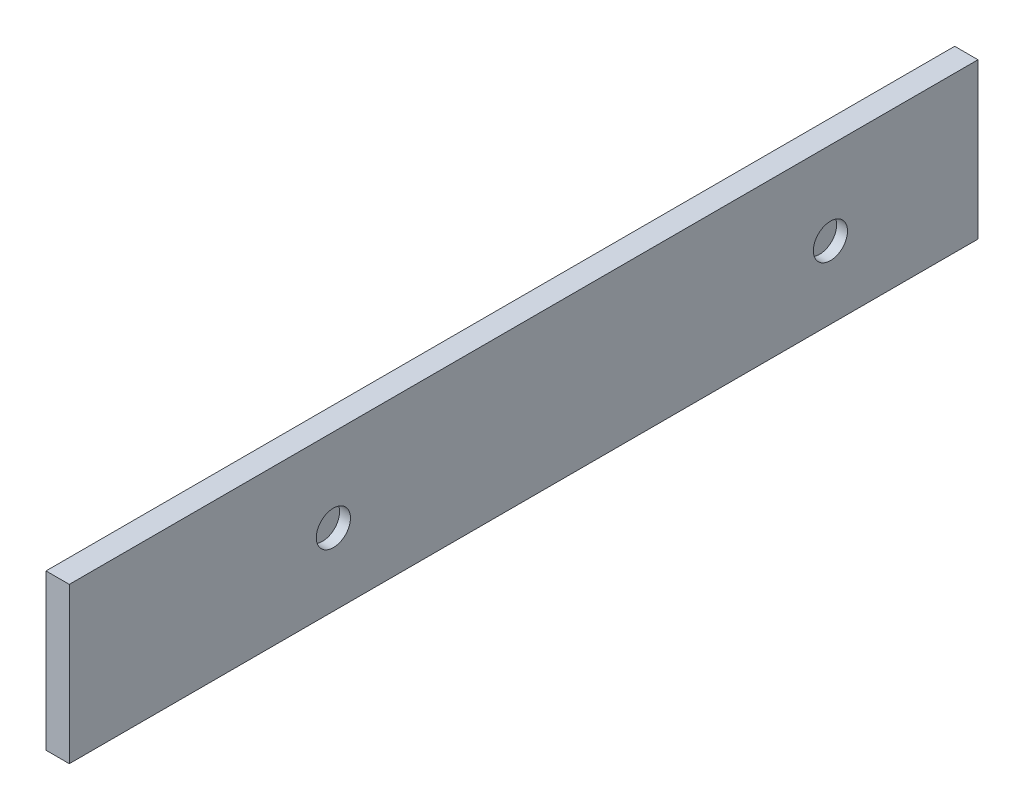
ISO-10303-21;
HEADER;
FILE_DESCRIPTION(('STEP AP214'),'2;1');
FILE_NAME('part.step','',(''),(''),'','','');
FILE_SCHEMA(('AUTOMOTIVE_DESIGN { 1 0 10303 214 1 1 1 1 }'));
ENDSEC;
DATA;
#1=APPLICATION_CONTEXT('core data for automotive mechanical design processes');
#2=APPLICATION_PROTOCOL_DEFINITION('international standard','automotive_design',2000,#1);
#3=PRODUCT_CONTEXT('',#1,'mechanical');
#4=PRODUCT('Part','Part','',(#3));
#5=PRODUCT_RELATED_PRODUCT_CATEGORY('part','',(#4));
#6=PRODUCT_DEFINITION_FORMATION('','',#4);
#7=PRODUCT_DEFINITION_CONTEXT('part definition',#1,'design');
#8=PRODUCT_DEFINITION('design','',#6,#7);
#9=PRODUCT_DEFINITION_SHAPE('','',#8);
#10=(LENGTH_UNIT() NAMED_UNIT(*) SI_UNIT(.MILLI.,.METRE.));
#11=(NAMED_UNIT(*) PLANE_ANGLE_UNIT() SI_UNIT($,.RADIAN.));
#12=(NAMED_UNIT(*) SI_UNIT($,.STERADIAN.) SOLID_ANGLE_UNIT());
#13=UNCERTAINTY_MEASURE_WITH_UNIT(LENGTH_MEASURE(1.E-05),#10,'distance_accuracy_value','');
#14=(GEOMETRIC_REPRESENTATION_CONTEXT(3) GLOBAL_UNCERTAINTY_ASSIGNED_CONTEXT((#13)) GLOBAL_UNIT_ASSIGNED_CONTEXT((#10,
#11,#12)) REPRESENTATION_CONTEXT('',''));
#15=CARTESIAN_POINT('',(0.,0.,0.));
#16=DIRECTION('',(0.,0.,1.));
#17=DIRECTION('',(1.,0.,0.));
#18=AXIS2_PLACEMENT_3D('',#15,#16,#17);
#19=CARTESIAN_POINT('',(15.,0.,0.));
#20=DIRECTION('',(0.,0.,-1.));
#21=DIRECTION('',(-1.,0.,0.));
#22=AXIS2_PLACEMENT_3D('',#19,#20,#21);
#23=PLANE('',#22);
#24=DIRECTION('',(0.,-1.,0.));
#25=VECTOR('',#24,1.);
#26=CARTESIAN_POINT('',(0.,0.,0.));
#27=LINE('',#26,#25);
#28=CARTESIAN_POINT('',(0.,100.,0.));
#29=VERTEX_POINT('',#28);
#30=CARTESIAN_POINT('',(0.,0.,0.));
#31=VERTEX_POINT('',#30);
#32=EDGE_CURVE('E96',#29,#31,#27,.T.);
#33=ORIENTED_EDGE('',*,*,#32,.T.);
#34=DIRECTION('',(-1.,0.,0.));
#35=VECTOR('',#34,1.);
#36=CARTESIAN_POINT('',(15.,0.,0.));
#37=LINE('',#36,#35);
#38=CARTESIAN_POINT('',(15.,0.,0.));
#39=VERTEX_POINT('',#38);
#40=EDGE_CURVE('E11',#39,#31,#37,.T.);
#41=ORIENTED_EDGE('',*,*,#40,.F.);
#42=DIRECTION('',(0.,-1.,0.));
#43=VECTOR('',#42,1.);
#44=CARTESIAN_POINT('',(15.,0.,0.));
#45=LINE('',#44,#43);
#46=CARTESIAN_POINT('',(15.,100.,0.));
#47=VERTEX_POINT('',#46);
#48=EDGE_CURVE('E84',#47,#39,#45,.T.);
#49=ORIENTED_EDGE('',*,*,#48,.F.);
#50=DIRECTION('',(-1.,0.,0.));
#51=VECTOR('',#50,1.);
#52=CARTESIAN_POINT('',(15.,100.,0.));
#53=LINE('',#52,#51);
#54=EDGE_CURVE('E92',#47,#29,#53,.T.);
#55=ORIENTED_EDGE('',*,*,#54,.T.);
#56=EDGE_LOOP('',(#33,#41,#49,#55));
#57=FACE_BOUND('',#56,.T.);
#58=ADVANCED_FACE('F33',(#57),#23,.F.);
#59=CARTESIAN_POINT('',(15.,0.,0.));
#60=DIRECTION('',(0.,1.,0.));
#61=DIRECTION('',(0.,0.,1.));
#62=AXIS2_PLACEMENT_3D('',#59,#60,#61);
#63=PLANE('',#62);
#64=DIRECTION('',(0.,0.,-1.));
#65=VECTOR('',#64,1.);
#66=CARTESIAN_POINT('',(0.,0.,0.));
#67=LINE('',#66,#65);
#68=CARTESIAN_POINT('',(0.,0.,-585.));
#69=VERTEX_POINT('',#68);
#70=EDGE_CURVE('E88',#31,#69,#67,.T.);
#71=ORIENTED_EDGE('',*,*,#70,.T.);
#72=DIRECTION('',(-1.,0.,0.));
#73=VECTOR('',#72,1.);
#74=CARTESIAN_POINT('',(15.,0.,-585.));
#75=LINE('',#74,#73);
#76=CARTESIAN_POINT('',(15.,0.,-585.));
#77=VERTEX_POINT('',#76);
#78=EDGE_CURVE('E41',#77,#69,#75,.T.);
#79=ORIENTED_EDGE('',*,*,#78,.F.);
#80=DIRECTION('',(0.,0.,-1.));
#81=VECTOR('',#80,1.);
#82=CARTESIAN_POINT('',(15.,0.,0.));
#83=LINE('',#82,#81);
#84=EDGE_CURVE('E79',#39,#77,#83,.T.);
#85=ORIENTED_EDGE('',*,*,#84,.F.);
#86=ORIENTED_EDGE('',*,*,#40,.T.);
#87=EDGE_LOOP('',(#71,#79,#85,#86));
#88=FACE_BOUND('',#87,.T.);
#89=ADVANCED_FACE('F87',(#88),#63,.F.);
#90=CARTESIAN_POINT('',(15.,0.,-585.));
#91=DIRECTION('',(0.,0.,1.));
#92=DIRECTION('',(1.,0.,0.));
#93=AXIS2_PLACEMENT_3D('',#90,#91,#92);
#94=PLANE('',#93);
#95=DIRECTION('',(0.,1.,0.));
#96=VECTOR('',#95,1.);
#97=CARTESIAN_POINT('',(0.,0.,-585.));
#98=LINE('',#97,#96);
#99=CARTESIAN_POINT('',(0.,100.,-585.));
#100=VERTEX_POINT('',#99);
#101=EDGE_CURVE('E66',#69,#100,#98,.T.);
#102=ORIENTED_EDGE('',*,*,#101,.T.);
#103=DIRECTION('',(-1.,0.,0.));
#104=VECTOR('',#103,1.);
#105=CARTESIAN_POINT('',(15.,100.,-585.));
#106=LINE('',#105,#104);
#107=CARTESIAN_POINT('',(15.,100.,-585.));
#108=VERTEX_POINT('',#107);
#109=EDGE_CURVE('E89',#108,#100,#106,.T.);
#110=ORIENTED_EDGE('',*,*,#109,.F.);
#111=DIRECTION('',(0.,1.,0.));
#112=VECTOR('',#111,1.);
#113=CARTESIAN_POINT('',(15.,0.,-585.));
#114=LINE('',#113,#112);
#115=EDGE_CURVE('E82',#77,#108,#114,.T.);
#116=ORIENTED_EDGE('',*,*,#115,.F.);
#117=ORIENTED_EDGE('',*,*,#78,.T.);
#118=EDGE_LOOP('',(#102,#110,#116,#117));
#119=FACE_BOUND('',#118,.T.);
#120=ADVANCED_FACE('F90',(#119),#94,.F.);
#121=CARTESIAN_POINT('',(15.,100.,0.));
#122=DIRECTION('',(0.,-1.,0.));
#123=DIRECTION('',(0.,0.,-1.));
#124=AXIS2_PLACEMENT_3D('',#121,#122,#123);
#125=PLANE('',#124);
#126=DIRECTION('',(0.,0.,1.));
#127=VECTOR('',#126,1.);
#128=CARTESIAN_POINT('',(0.,100.,0.));
#129=LINE('',#128,#127);
#130=EDGE_CURVE('E72',#100,#29,#129,.T.);
#131=ORIENTED_EDGE('',*,*,#130,.T.);
#132=ORIENTED_EDGE('',*,*,#54,.F.);
#133=DIRECTION('',(0.,0.,1.));
#134=VECTOR('',#133,1.);
#135=CARTESIAN_POINT('',(15.,100.,0.));
#136=LINE('',#135,#134);
#137=EDGE_CURVE('E49',#108,#47,#136,.T.);
#138=ORIENTED_EDGE('',*,*,#137,.F.);
#139=ORIENTED_EDGE('',*,*,#109,.T.);
#140=EDGE_LOOP('',(#131,#132,#138,#139));
#141=FACE_BOUND('',#140,.T.);
#142=ADVANCED_FACE('F104',(#141),#125,.F.);
#143=CARTESIAN_POINT('',(15.,0.,0.));
#144=DIRECTION('',(-1.,0.,0.));
#145=DIRECTION('',(0.,0.,1.));
#146=AXIS2_PLACEMENT_3D('',#143,#144,#145);
#147=PLANE('',#146);
#148=CARTESIAN_POINT('',(15.,46.5,-490.));
#149=DIRECTION('',(1.,0.,0.));
#150=DIRECTION('',(0.,0.,-1.));
#151=AXIS2_PLACEMENT_3D('',#148,#149,#150);
#152=CIRCLE('',#151,11.);
#153=CARTESIAN_POINT('',(15.,46.5,-501.));
#154=VERTEX_POINT('',#153);
#155=EDGE_CURVE('E116',#154,#154,#152,.T.);
#156=ORIENTED_EDGE('',*,*,#155,.F.);
#157=EDGE_LOOP('',(#156));
#158=FACE_BOUND('',#157,.T.);
#159=CARTESIAN_POINT('',(15.,46.5,-170.));
#160=DIRECTION('',(1.,0.,0.));
#161=DIRECTION('',(0.,0.,-1.));
#162=AXIS2_PLACEMENT_3D('',#159,#160,#161);
#163=CIRCLE('',#162,11.);
#164=CARTESIAN_POINT('',(15.,46.5,-181.));
#165=VERTEX_POINT('',#164);
#166=EDGE_CURVE('E110',#165,#165,#163,.T.);
#167=ORIENTED_EDGE('',*,*,#166,.F.);
#168=EDGE_LOOP('',(#167));
#169=FACE_BOUND('',#168,.T.);
#170=ORIENTED_EDGE('',*,*,#48,.T.);
#171=ORIENTED_EDGE('',*,*,#84,.T.);
#172=ORIENTED_EDGE('',*,*,#115,.T.);
#173=ORIENTED_EDGE('',*,*,#137,.T.);
#174=EDGE_LOOP('',(#170,#171,#172,#173));
#175=FACE_BOUND('',#174,.T.);
#176=ADVANCED_FACE('F80',(#158,#169,#175),#147,.F.);
#177=CARTESIAN_POINT('',(0.,0.,0.));
#178=DIRECTION('',(-1.,0.,0.));
#179=DIRECTION('',(0.,0.,1.));
#180=AXIS2_PLACEMENT_3D('',#177,#178,#179);
#181=PLANE('',#180);
#182=ORIENTED_EDGE('',*,*,#32,.F.);
#183=ORIENTED_EDGE('',*,*,#130,.F.);
#184=ORIENTED_EDGE('',*,*,#101,.F.);
#185=ORIENTED_EDGE('',*,*,#70,.F.);
#186=EDGE_LOOP('',(#182,#183,#184,#185));
#187=FACE_BOUND('',#186,.T.);
#188=ADVANCED_FACE('F107',(#187),#181,.T.);
#189=CARTESIAN_POINT('',(8.,46.5,-170.));
#190=DIRECTION('',(1.,0.,0.));
#191=DIRECTION('',(0.,0.,-1.));
#192=AXIS2_PLACEMENT_3D('',#189,#190,#191);
#193=CYLINDRICAL_SURFACE('',#192,11.);
#194=CARTESIAN_POINT('',(8.,46.5,-170.));
#195=DIRECTION('',(1.,0.,0.));
#196=DIRECTION('',(0.,0.,-1.));
#197=AXIS2_PLACEMENT_3D('',#194,#195,#196);
#198=CIRCLE('',#197,11.);
#199=CARTESIAN_POINT('',(8.,46.5,-181.));
#200=VERTEX_POINT('',#199);
#201=EDGE_CURVE('E99',#200,#200,#198,.T.);
#202=ORIENTED_EDGE('',*,*,#201,.F.);
#203=EDGE_LOOP('',(#202));
#204=FACE_BOUND('',#203,.T.);
#205=ORIENTED_EDGE('',*,*,#166,.T.);
#206=EDGE_LOOP('',(#205));
#207=FACE_BOUND('',#206,.T.);
#208=ADVANCED_FACE('F136',(#204,#207),#193,.F.);
#209=CARTESIAN_POINT('',(8.,46.5,-170.));
#210=DIRECTION('',(1.,0.,0.));
#211=DIRECTION('',(0.,0.,-1.));
#212=AXIS2_PLACEMENT_3D('',#209,#210,#211);
#213=PLANE('',#212);
#214=ORIENTED_EDGE('',*,*,#201,.T.);
#215=EDGE_LOOP('',(#214));
#216=FACE_BOUND('',#215,.T.);
#217=ADVANCED_FACE('F127',(#216),#213,.T.);
#218=CARTESIAN_POINT('',(8.,46.5,-490.));
#219=DIRECTION('',(1.,0.,0.));
#220=DIRECTION('',(0.,0.,-1.));
#221=AXIS2_PLACEMENT_3D('',#218,#219,#220);
#222=CYLINDRICAL_SURFACE('',#221,11.);
#223=CARTESIAN_POINT('',(8.,46.5,-490.));
#224=DIRECTION('',(1.,0.,0.));
#225=DIRECTION('',(0.,0.,-1.));
#226=AXIS2_PLACEMENT_3D('',#223,#224,#225);
#227=CIRCLE('',#226,11.);
#228=CARTESIAN_POINT('',(8.,46.5,-501.));
#229=VERTEX_POINT('',#228);
#230=EDGE_CURVE('E113',#229,#229,#227,.T.);
#231=ORIENTED_EDGE('',*,*,#230,.F.);
#232=EDGE_LOOP('',(#231));
#233=FACE_BOUND('',#232,.T.);
#234=ORIENTED_EDGE('',*,*,#155,.T.);
#235=EDGE_LOOP('',(#234));
#236=FACE_BOUND('',#235,.T.);
#237=ADVANCED_FACE('F124',(#233,#236),#222,.F.);
#238=CARTESIAN_POINT('',(8.,46.5,-490.));
#239=DIRECTION('',(1.,0.,0.));
#240=DIRECTION('',(0.,0.,-1.));
#241=AXIS2_PLACEMENT_3D('',#238,#239,#240);
#242=PLANE('',#241);
#243=ORIENTED_EDGE('',*,*,#230,.T.);
#244=EDGE_LOOP('',(#243));
#245=FACE_BOUND('',#244,.T.);
#246=ADVANCED_FACE('F122',(#245),#242,.T.);
#247=CLOSED_SHELL('',(#58,#89,#120,#142,#176,#188,#208,#217,#237,#246));
#248=MANIFOLD_SOLID_BREP('B2',#247);
#249=ADVANCED_BREP_SHAPE_REPRESENTATION('',(#18,#248),#14);
#250=SHAPE_DEFINITION_REPRESENTATION(#9,#249);
ENDSEC;
END-ISO-10303-21;
